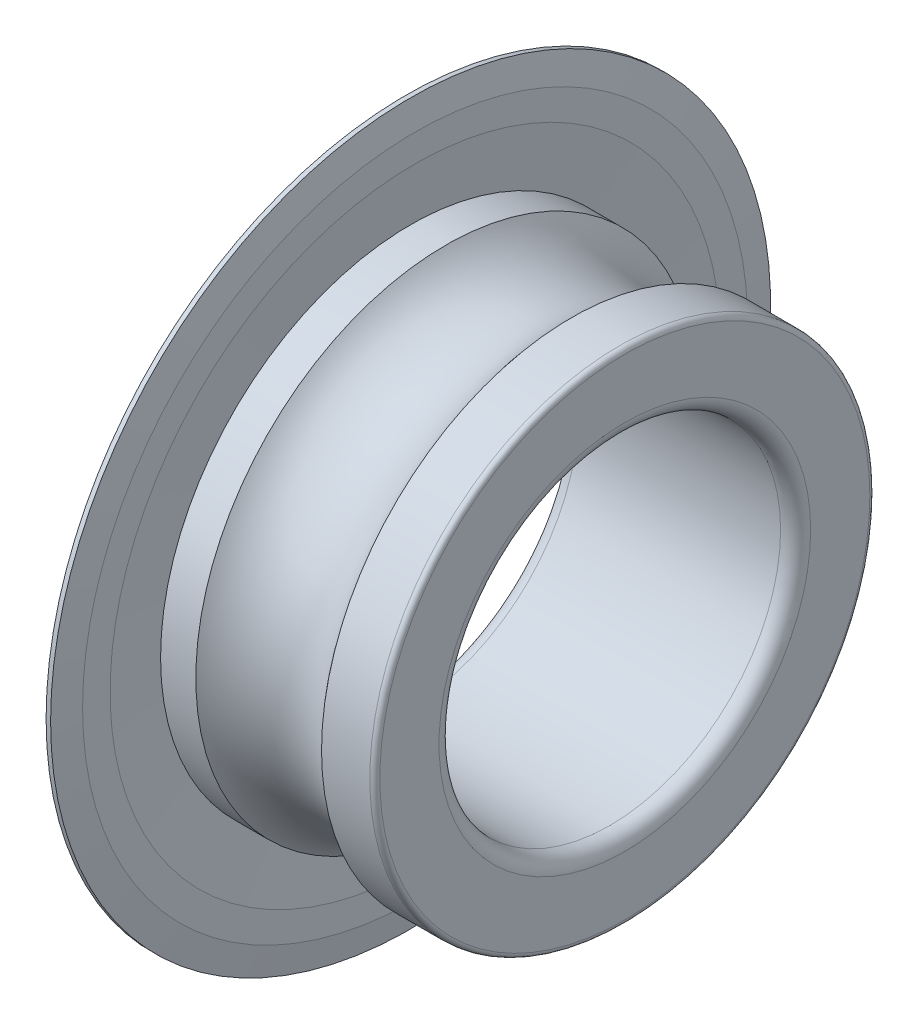
ISO-10303-21;
HEADER;
FILE_DESCRIPTION(('STEP AP214'),'2;1');
FILE_NAME('part.step','',(''),(''),'','','');
FILE_SCHEMA(('AUTOMOTIVE_DESIGN { 1 0 10303 214 1 1 1 1 }'));
ENDSEC;
DATA;
#1=APPLICATION_CONTEXT('core data for automotive mechanical design processes');
#2=APPLICATION_PROTOCOL_DEFINITION('international standard','automotive_design',2000,#1);
#3=PRODUCT_CONTEXT('',#1,'mechanical');
#4=PRODUCT('Part','Part','',(#3));
#5=PRODUCT_RELATED_PRODUCT_CATEGORY('part','',(#4));
#6=PRODUCT_DEFINITION_FORMATION('','',#4);
#7=PRODUCT_DEFINITION_CONTEXT('part definition',#1,'design');
#8=PRODUCT_DEFINITION('design','',#6,#7);
#9=PRODUCT_DEFINITION_SHAPE('','',#8);
#10=(LENGTH_UNIT() NAMED_UNIT(*) SI_UNIT(.MILLI.,.METRE.));
#11=(NAMED_UNIT(*) PLANE_ANGLE_UNIT() SI_UNIT($,.RADIAN.));
#12=(NAMED_UNIT(*) SI_UNIT($,.STERADIAN.) SOLID_ANGLE_UNIT());
#13=UNCERTAINTY_MEASURE_WITH_UNIT(LENGTH_MEASURE(1.E-05),#10,'distance_accuracy_value','');
#14=(GEOMETRIC_REPRESENTATION_CONTEXT(3) GLOBAL_UNCERTAINTY_ASSIGNED_CONTEXT((#13)) GLOBAL_UNIT_ASSIGNED_CONTEXT((#10,
#11,#12)) REPRESENTATION_CONTEXT('',''));
#15=CARTESIAN_POINT('',(0.,0.,0.));
#16=DIRECTION('',(0.,0.,1.));
#17=DIRECTION('',(1.,0.,0.));
#18=AXIS2_PLACEMENT_3D('',#15,#16,#17);
#19=CARTESIAN_POINT('',(1.31999999999999,0.,0.));
#20=DIRECTION('',(-1.,0.,0.));
#21=DIRECTION('',(0.,0.,1.));
#22=AXIS2_PLACEMENT_3D('',#19,#20,#21);
#23=CONICAL_SURFACE('',#22,26.35,1.40826755471207);
#24=CARTESIAN_POINT('',(1.65,0.,0.));
#25=DIRECTION('',(-1.,0.,0.));
#26=DIRECTION('',(0.,0.,1.));
#27=AXIS2_PLACEMENT_3D('',#24,#25,#26);
#28=CIRCLE('',#27,24.3375);
#29=CARTESIAN_POINT('',(1.65,0.,24.3375));
#30=VERTEX_POINT('',#29);
#31=EDGE_CURVE('E17',#30,#30,#28,.F.);
#32=ORIENTED_EDGE('',*,*,#31,.F.);
#33=EDGE_LOOP('',(#32));
#34=FACE_BOUND('',#33,.T.);
#35=CARTESIAN_POINT('',(1.32,0.,0.));
#36=DIRECTION('',(-1.,0.,0.));
#37=DIRECTION('',(0.,0.,1.));
#38=AXIS2_PLACEMENT_3D('',#35,#36,#37);
#39=CIRCLE('',#38,26.35);
#40=CARTESIAN_POINT('',(1.32,0.,26.35));
#41=VERTEX_POINT('',#40);
#42=EDGE_CURVE('E356',#41,#41,#39,.T.);
#43=ORIENTED_EDGE('',*,*,#42,.F.);
#44=EDGE_LOOP('',(#43));
#45=FACE_BOUND('',#44,.T.);
#46=ADVANCED_FACE('F14',(#34,#45),#23,.T.);
#47=CARTESIAN_POINT('',(1.65,22.325,0.));
#48=DIRECTION('',(1.,0.,0.));
#49=DIRECTION('',(0.,0.,-1.));
#50=AXIS2_PLACEMENT_3D('',#47,#48,#49);
#51=PLANE('',#50);
#52=CARTESIAN_POINT('',(1.64999999999998,0.,0.));
#53=DIRECTION('',(1.,0.,0.));
#54=DIRECTION('',(0.,0.,-1.));
#55=AXIS2_PLACEMENT_3D('',#52,#53,#54);
#56=CIRCLE('',#55,22.325);
#57=CARTESIAN_POINT('',(1.64999999999998,0.,-22.325));
#58=VERTEX_POINT('',#57);
#59=EDGE_CURVE('E354',#58,#58,#56,.F.);
#60=ORIENTED_EDGE('',*,*,#59,.T.);
#61=EDGE_LOOP('',(#60));
#62=FACE_BOUND('',#61,.T.);
#63=ORIENTED_EDGE('',*,*,#31,.T.);
#64=EDGE_LOOP('',(#63));
#65=FACE_BOUND('',#64,.T.);
#66=ADVANCED_FACE('F184',(#62,#65),#51,.T.);
#67=CARTESIAN_POINT('',(50.,0.,0.));
#68=DIRECTION('',(-1.,0.,0.));
#69=DIRECTION('',(0.,0.,1.));
#70=AXIS2_PLACEMENT_3D('',#67,#68,#69);
#71=CYLINDRICAL_SURFACE('',#70,26.35);
#72=ORIENTED_EDGE('',*,*,#42,.T.);
#73=EDGE_LOOP('',(#72));
#74=FACE_BOUND('',#73,.T.);
#75=CARTESIAN_POINT('',(0.989999999999998,0.,0.));
#76=DIRECTION('',(-1.,0.,0.));
#77=DIRECTION('',(0.,0.,1.));
#78=AXIS2_PLACEMENT_3D('',#75,#76,#77);
#79=CIRCLE('',#78,26.35);
#80=CARTESIAN_POINT('',(0.989999999999998,0.,26.35));
#81=VERTEX_POINT('',#80);
#82=EDGE_CURVE('E355',#81,#81,#79,.F.);
#83=ORIENTED_EDGE('',*,*,#82,.T.);
#84=EDGE_LOOP('',(#83));
#85=FACE_BOUND('',#84,.T.);
#86=ADVANCED_FACE('F181',(#74,#85),#71,.T.);
#87=CARTESIAN_POINT('',(1.64999999999998,0.,0.));
#88=DIRECTION('',(1.,0.,0.));
#89=DIRECTION('',(0.,0.,-1.));
#90=AXIS2_PLACEMENT_3D('',#87,#88,#89);
#91=CONICAL_SURFACE('',#90,22.325,1.48899171759392);
#92=CARTESIAN_POINT('',(1.32,0.,0.));
#93=DIRECTION('',(-1.,0.,0.));
#94=DIRECTION('',(0.,0.,1.));
#95=AXIS2_PLACEMENT_3D('',#92,#93,#94);
#96=CIRCLE('',#95,18.3);
#97=CARTESIAN_POINT('',(1.32,0.,18.3));
#98=VERTEX_POINT('',#97);
#99=EDGE_CURVE('E359',#98,#98,#96,.F.);
#100=ORIENTED_EDGE('',*,*,#99,.F.);
#101=EDGE_LOOP('',(#100));
#102=FACE_BOUND('',#101,.T.);
#103=ORIENTED_EDGE('',*,*,#59,.F.);
#104=EDGE_LOOP('',(#103));
#105=FACE_BOUND('',#104,.T.);
#106=ADVANCED_FACE('F177',(#102,#105),#91,.F.);
#107=CARTESIAN_POINT('',(0.989999999999998,0.,0.));
#108=DIRECTION('',(-1.,0.,0.));
#109=DIRECTION('',(0.,0.,1.));
#110=AXIS2_PLACEMENT_3D('',#107,#108,#109);
#111=CONICAL_SURFACE('',#110,26.35,1.48899171759391);
#112=ORIENTED_EDGE('',*,*,#82,.F.);
#113=EDGE_LOOP('',(#112));
#114=FACE_BOUND('',#113,.T.);
#115=CARTESIAN_POINT('',(1.155,0.,0.));
#116=DIRECTION('',(1.,0.,0.));
#117=DIRECTION('',(0.,0.,-1.));
#118=AXIS2_PLACEMENT_3D('',#115,#116,#117);
#119=CIRCLE('',#118,24.3375);
#120=CARTESIAN_POINT('',(1.155,0.,-24.3375));
#121=VERTEX_POINT('',#120);
#122=EDGE_CURVE('E371',#121,#121,#119,.F.);
#123=ORIENTED_EDGE('',*,*,#122,.F.);
#124=EDGE_LOOP('',(#123));
#125=FACE_BOUND('',#124,.T.);
#126=ADVANCED_FACE('F173',(#114,#125),#111,.F.);
#127=CARTESIAN_POINT('',(50.,0.,0.));
#128=DIRECTION('',(-1.,0.,0.));
#129=DIRECTION('',(0.,0.,1.));
#130=AXIS2_PLACEMENT_3D('',#127,#128,#129);
#131=CYLINDRICAL_SURFACE('',#130,18.3);
#132=CARTESIAN_POINT('',(3.9,0.,0.));
#133=DIRECTION('',(1.,0.,0.));
#134=DIRECTION('',(0.,0.,-1.));
#135=AXIS2_PLACEMENT_3D('',#132,#133,#134);
#136=CIRCLE('',#135,18.3);
#137=CARTESIAN_POINT('',(3.9,0.,-18.3));
#138=VERTEX_POINT('',#137);
#139=EDGE_CURVE('E157',#138,#138,#136,.F.);
#140=ORIENTED_EDGE('',*,*,#139,.T.);
#141=EDGE_LOOP('',(#140));
#142=FACE_BOUND('',#141,.T.);
#143=ORIENTED_EDGE('',*,*,#99,.T.);
#144=EDGE_LOOP('',(#143));
#145=FACE_BOUND('',#144,.T.);
#146=ADVANCED_FACE('F169',(#142,#145),#131,.T.);
#147=CARTESIAN_POINT('',(1.155,0.,0.));
#148=DIRECTION('',(1.,0.,0.));
#149=DIRECTION('',(0.,0.,-1.));
#150=AXIS2_PLACEMENT_3D('',#147,#148,#149);
#151=CONICAL_SURFACE('',#150,24.3375,1.48899171759391);
#152=ORIENTED_EDGE('',*,*,#122,.T.);
#153=EDGE_LOOP('',(#152));
#154=FACE_BOUND('',#153,.T.);
#155=CARTESIAN_POINT('',(0.989999999999989,0.,0.));
#156=DIRECTION('',(1.,0.,0.));
#157=DIRECTION('',(0.,0.,-1.));
#158=AXIS2_PLACEMENT_3D('',#155,#156,#157);
#159=CIRCLE('',#158,22.325);
#160=CARTESIAN_POINT('',(0.989999999999989,0.,-22.325));
#161=VERTEX_POINT('',#160);
#162=EDGE_CURVE('E152',#161,#161,#159,.F.);
#163=ORIENTED_EDGE('',*,*,#162,.F.);
#164=EDGE_LOOP('',(#163));
#165=FACE_BOUND('',#164,.T.);
#166=ADVANCED_FACE('F165',(#154,#165),#151,.T.);
#167=CARTESIAN_POINT('',(8.5,0.,0.));
#168=DIRECTION('',(1.,0.,0.));
#169=DIRECTION('',(0.,0.,-1.));
#170=AXIS2_PLACEMENT_3D('',#167,#168,#169);
#171=TOROIDAL_SURFACE('',#170,21.75,5.75);
#172=ORIENTED_EDGE('',*,*,#139,.F.);
#173=EDGE_LOOP('',(#172));
#174=FACE_BOUND('',#173,.T.);
#175=CARTESIAN_POINT('',(13.1,0.,0.));
#176=DIRECTION('',(-1.,0.,0.));
#177=DIRECTION('',(0.,0.,1.));
#178=AXIS2_PLACEMENT_3D('',#175,#176,#177);
#179=CIRCLE('',#178,18.3);
#180=CARTESIAN_POINT('',(13.1,0.,18.3));
#181=VERTEX_POINT('',#180);
#182=EDGE_CURVE('E143',#181,#181,#179,.F.);
#183=ORIENTED_EDGE('',*,*,#182,.F.);
#184=EDGE_LOOP('',(#183));
#185=FACE_BOUND('',#184,.T.);
#186=ADVANCED_FACE('F160',(#174,#185),#171,.F.);
#187=CARTESIAN_POINT('',(0.99,22.325,0.));
#188=DIRECTION('',(-1.,0.,0.));
#189=DIRECTION('',(0.,0.,1.));
#190=AXIS2_PLACEMENT_3D('',#187,#188,#189);
#191=PLANE('',#190);
#192=ORIENTED_EDGE('',*,*,#162,.T.);
#193=EDGE_LOOP('',(#192));
#194=FACE_BOUND('',#193,.T.);
#195=CARTESIAN_POINT('',(0.989999999999998,0.,0.));
#196=DIRECTION('',(-1.,0.,0.));
#197=DIRECTION('',(0.,0.,1.));
#198=AXIS2_PLACEMENT_3D('',#195,#196,#197);
#199=CIRCLE('',#198,18.3);
#200=CARTESIAN_POINT('',(0.989999999999998,0.,18.3));
#201=VERTEX_POINT('',#200);
#202=EDGE_CURVE('E151',#201,#201,#199,.T.);
#203=ORIENTED_EDGE('',*,*,#202,.F.);
#204=EDGE_LOOP('',(#203));
#205=FACE_BOUND('',#204,.T.);
#206=ADVANCED_FACE('F164',(#194,#205),#191,.T.);
#207=CARTESIAN_POINT('',(50.,0.,0.));
#208=DIRECTION('',(-1.,0.,0.));
#209=DIRECTION('',(0.,0.,1.));
#210=AXIS2_PLACEMENT_3D('',#207,#208,#209);
#211=CYLINDRICAL_SURFACE('',#210,18.3);
#212=CARTESIAN_POINT('',(16.6333333333333,0.,0.));
#213=DIRECTION('',(1.,0.,0.));
#214=DIRECTION('',(0.,0.,-1.));
#215=AXIS2_PLACEMENT_3D('',#212,#213,#214);
#216=CIRCLE('',#215,18.3);
#217=CARTESIAN_POINT('',(16.6333333333333,0.,-18.3));
#218=VERTEX_POINT('',#217);
#219=EDGE_CURVE('E112',#218,#218,#216,.T.);
#220=ORIENTED_EDGE('',*,*,#219,.F.);
#221=EDGE_LOOP('',(#220));
#222=FACE_BOUND('',#221,.T.);
#223=ORIENTED_EDGE('',*,*,#182,.T.);
#224=EDGE_LOOP('',(#223));
#225=FACE_BOUND('',#224,.T.);
#226=ADVANCED_FACE('F249',(#222,#225),#211,.T.);
#227=CARTESIAN_POINT('',(50.,0.,0.));
#228=DIRECTION('',(-1.,0.,0.));
#229=DIRECTION('',(0.,0.,1.));
#230=AXIS2_PLACEMENT_3D('',#227,#228,#229);
#231=CYLINDRICAL_SURFACE('',#230,18.3);
#232=ORIENTED_EDGE('',*,*,#202,.T.);
#233=EDGE_LOOP('',(#232));
#234=FACE_BOUND('',#233,.T.);
#235=CARTESIAN_POINT('',(0.36666666666667,0.,0.));
#236=DIRECTION('',(1.,0.,0.));
#237=DIRECTION('',(0.,0.,-1.));
#238=AXIS2_PLACEMENT_3D('',#235,#236,#237);
#239=CIRCLE('',#238,18.3);
#240=CARTESIAN_POINT('',(0.36666666666667,0.,-18.3));
#241=VERTEX_POINT('',#240);
#242=EDGE_CURVE('E109',#241,#241,#239,.F.);
#243=ORIENTED_EDGE('',*,*,#242,.F.);
#244=EDGE_LOOP('',(#243));
#245=FACE_BOUND('',#244,.T.);
#246=ADVANCED_FACE('F135',(#234,#245),#231,.T.);
#247=CARTESIAN_POINT('',(16.6333333333333,0.,0.));
#248=DIRECTION('',(1.,0.,0.));
#249=DIRECTION('',(0.,0.,-1.));
#250=AXIS2_PLACEMENT_3D('',#247,#248,#249);
#251=TOROIDAL_SURFACE('',#250,17.9333333333333,0.366666666666675);
#252=CARTESIAN_POINT('',(17.,0.,0.));
#253=DIRECTION('',(-1.,0.,0.));
#254=DIRECTION('',(0.,0.,-1.));
#255=AXIS2_PLACEMENT_3D('',#252,#253,#254);
#256=CIRCLE('',#255,17.9333333333333);
#257=CARTESIAN_POINT('',(17.,0.,-17.9333333333333));
#258=VERTEX_POINT('',#257);
#259=EDGE_CURVE('E64',#258,#258,#256,.F.);
#260=ORIENTED_EDGE('',*,*,#259,.F.);
#261=EDGE_LOOP('',(#260));
#262=FACE_BOUND('',#261,.T.);
#263=ORIENTED_EDGE('',*,*,#219,.T.);
#264=EDGE_LOOP('',(#263));
#265=FACE_BOUND('',#264,.T.);
#266=ADVANCED_FACE('F131',(#262,#265),#251,.T.);
#267=CARTESIAN_POINT('',(0.36666666666667,0.,0.));
#268=DIRECTION('',(1.,0.,0.));
#269=DIRECTION('',(0.,0.,-1.));
#270=AXIS2_PLACEMENT_3D('',#267,#268,#269);
#271=TOROIDAL_SURFACE('',#270,17.9333333333333,0.366666666666671);
#272=ORIENTED_EDGE('',*,*,#242,.T.);
#273=EDGE_LOOP('',(#272));
#274=FACE_BOUND('',#273,.T.);
#275=CARTESIAN_POINT('',(0.,0.,0.));
#276=DIRECTION('',(1.,0.,0.));
#277=DIRECTION('',(0.,0.,-1.));
#278=AXIS2_PLACEMENT_3D('',#275,#276,#277);
#279=CIRCLE('',#278,17.9333333333333);
#280=CARTESIAN_POINT('',(0.,0.,-17.9333333333333));
#281=VERTEX_POINT('',#280);
#282=EDGE_CURVE('E119',#281,#281,#279,.F.);
#283=ORIENTED_EDGE('',*,*,#282,.F.);
#284=EDGE_LOOP('',(#283));
#285=FACE_BOUND('',#284,.T.);
#286=ADVANCED_FACE('F81',(#274,#285),#271,.T.);
#287=CARTESIAN_POINT('',(17.,13.6,0.));
#288=DIRECTION('',(1.,0.,0.));
#289=DIRECTION('',(0.,0.,-1.));
#290=AXIS2_PLACEMENT_3D('',#287,#288,#289);
#291=PLANE('',#290);
#292=CARTESIAN_POINT('',(17.,0.,0.));
#293=DIRECTION('',(1.,0.,0.));
#294=DIRECTION('',(0.,0.,-1.));
#295=AXIS2_PLACEMENT_3D('',#292,#293,#294);
#296=CIRCLE('',#295,13.6);
#297=CARTESIAN_POINT('',(17.,0.,-13.6));
#298=VERTEX_POINT('',#297);
#299=EDGE_CURVE('E99',#298,#298,#296,.T.);
#300=ORIENTED_EDGE('',*,*,#299,.F.);
#301=EDGE_LOOP('',(#300));
#302=FACE_BOUND('',#301,.T.);
#303=ORIENTED_EDGE('',*,*,#259,.T.);
#304=EDGE_LOOP('',(#303));
#305=FACE_BOUND('',#304,.T.);
#306=ADVANCED_FACE('F71',(#302,#305),#291,.T.);
#307=CARTESIAN_POINT('',(0.,17.9333333333333,0.));
#308=DIRECTION('',(-1.,0.,0.));
#309=DIRECTION('',(0.,0.,1.));
#310=AXIS2_PLACEMENT_3D('',#307,#308,#309);
#311=PLANE('',#310);
#312=ORIENTED_EDGE('',*,*,#282,.T.);
#313=EDGE_LOOP('',(#312));
#314=FACE_BOUND('',#313,.T.);
#315=CARTESIAN_POINT('',(0.,0.,0.));
#316=DIRECTION('',(-1.,0.,0.));
#317=DIRECTION('',(0.,0.,-1.));
#318=AXIS2_PLACEMENT_3D('',#315,#316,#317);
#319=CIRCLE('',#318,13.6);
#320=CARTESIAN_POINT('',(0.,0.,-13.6));
#321=VERTEX_POINT('',#320);
#322=EDGE_CURVE('E26',#321,#321,#319,.T.);
#323=ORIENTED_EDGE('',*,*,#322,.F.);
#324=EDGE_LOOP('',(#323));
#325=FACE_BOUND('',#324,.T.);
#326=ADVANCED_FACE('F80',(#314,#325),#311,.T.);
#327=CARTESIAN_POINT('',(15.9,0.,0.));
#328=DIRECTION('',(1.,0.,0.));
#329=DIRECTION('',(0.,0.,-1.));
#330=AXIS2_PLACEMENT_3D('',#327,#328,#329);
#331=TOROIDAL_SURFACE('',#330,13.6,1.10000000000001);
#332=CARTESIAN_POINT('',(15.9,0.,0.));
#333=DIRECTION('',(-1.,0.,0.));
#334=DIRECTION('',(0.,0.,1.));
#335=AXIS2_PLACEMENT_3D('',#332,#333,#334);
#336=CIRCLE('',#335,12.5);
#337=CARTESIAN_POINT('',(15.9,0.,12.5));
#338=VERTEX_POINT('',#337);
#339=EDGE_CURVE('E21',#338,#338,#336,.T.);
#340=ORIENTED_EDGE('',*,*,#339,.T.);
#341=EDGE_LOOP('',(#340));
#342=FACE_BOUND('',#341,.T.);
#343=ORIENTED_EDGE('',*,*,#299,.T.);
#344=EDGE_LOOP('',(#343));
#345=FACE_BOUND('',#344,.T.);
#346=ADVANCED_FACE('F44',(#342,#345),#331,.T.);
#347=CARTESIAN_POINT('',(1.1,0.,0.));
#348=DIRECTION('',(1.,0.,0.));
#349=DIRECTION('',(0.,0.,-1.));
#350=AXIS2_PLACEMENT_3D('',#347,#348,#349);
#351=TOROIDAL_SURFACE('',#350,13.6,1.1);
#352=ORIENTED_EDGE('',*,*,#322,.T.);
#353=EDGE_LOOP('',(#352));
#354=FACE_BOUND('',#353,.T.);
#355=CARTESIAN_POINT('',(1.1,0.,0.));
#356=DIRECTION('',(-1.,0.,0.));
#357=DIRECTION('',(0.,0.,1.));
#358=AXIS2_PLACEMENT_3D('',#355,#356,#357);
#359=CIRCLE('',#358,12.5);
#360=CARTESIAN_POINT('',(1.1,0.,12.5));
#361=VERTEX_POINT('',#360);
#362=EDGE_CURVE('E10',#361,#361,#359,.F.);
#363=ORIENTED_EDGE('',*,*,#362,.T.);
#364=EDGE_LOOP('',(#363));
#365=FACE_BOUND('',#364,.T.);
#366=ADVANCED_FACE('F38',(#354,#365),#351,.T.);
#367=CARTESIAN_POINT('',(50.,0.,0.));
#368=DIRECTION('',(-1.,0.,0.));
#369=DIRECTION('',(0.,0.,1.));
#370=AXIS2_PLACEMENT_3D('',#367,#368,#369);
#371=CYLINDRICAL_SURFACE('',#370,12.5);
#372=ORIENTED_EDGE('',*,*,#362,.F.);
#373=EDGE_LOOP('',(#372));
#374=FACE_BOUND('',#373,.T.);
#375=ORIENTED_EDGE('',*,*,#339,.F.);
#376=EDGE_LOOP('',(#375));
#377=FACE_BOUND('',#376,.T.);
#378=ADVANCED_FACE('F43',(#374,#377),#371,.F.);
#379=CLOSED_SHELL('',(#46,#66,#86,#106,#126,#146,#166,#186,#206,#226,#246,#266,#286,#306,#326,
#346,#366,#378));
#380=MANIFOLD_SOLID_BREP('B1',#379);
#381=ADVANCED_BREP_SHAPE_REPRESENTATION('',(#18,#380),#14);
#382=SHAPE_DEFINITION_REPRESENTATION(#9,#381);
ENDSEC;
END-ISO-10303-21;
